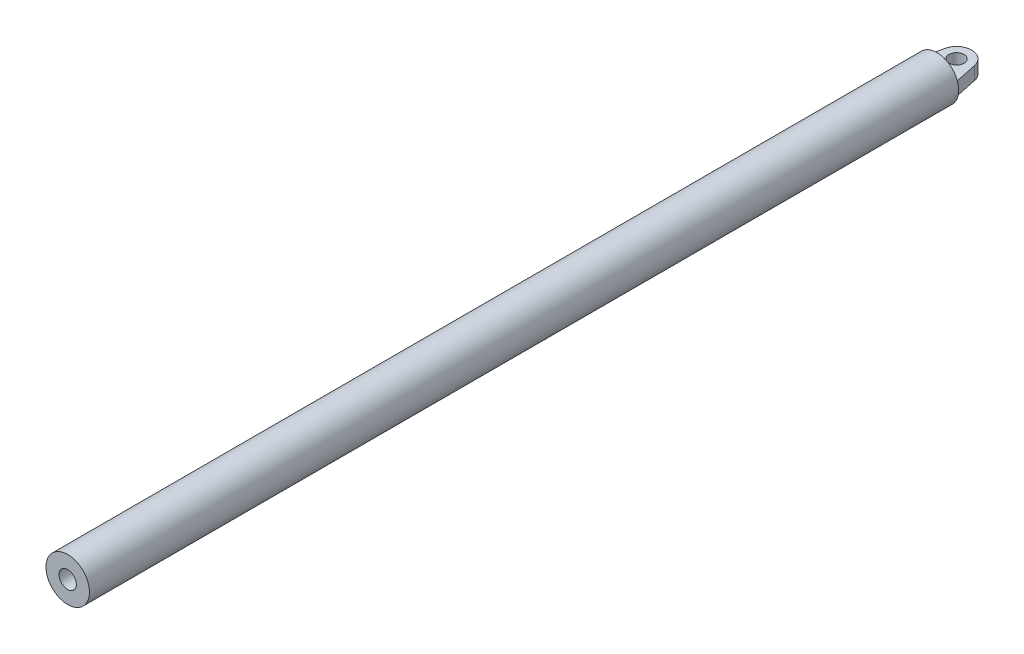
ISO-10303-21;
HEADER;
FILE_DESCRIPTION(('STEP AP214'),'2;1');
FILE_NAME('part.step','',(''),(''),'','','');
FILE_SCHEMA(('AUTOMOTIVE_DESIGN { 1 0 10303 214 1 1 1 1 }'));
ENDSEC;
DATA;
#1=APPLICATION_CONTEXT('core data for automotive mechanical design processes');
#2=APPLICATION_PROTOCOL_DEFINITION('international standard','automotive_design',2000,#1);
#3=PRODUCT_CONTEXT('',#1,'mechanical');
#4=PRODUCT('Part','Part','',(#3));
#5=PRODUCT_RELATED_PRODUCT_CATEGORY('part','',(#4));
#6=PRODUCT_DEFINITION_FORMATION('','',#4);
#7=PRODUCT_DEFINITION_CONTEXT('part definition',#1,'design');
#8=PRODUCT_DEFINITION('design','',#6,#7);
#9=PRODUCT_DEFINITION_SHAPE('','',#8);
#10=(LENGTH_UNIT() NAMED_UNIT(*) SI_UNIT(.MILLI.,.METRE.));
#11=(NAMED_UNIT(*) PLANE_ANGLE_UNIT() SI_UNIT($,.RADIAN.));
#12=(NAMED_UNIT(*) SI_UNIT($,.STERADIAN.) SOLID_ANGLE_UNIT());
#13=UNCERTAINTY_MEASURE_WITH_UNIT(LENGTH_MEASURE(1.E-05),#10,'distance_accuracy_value','');
#14=(GEOMETRIC_REPRESENTATION_CONTEXT(3) GLOBAL_UNCERTAINTY_ASSIGNED_CONTEXT((#13)) GLOBAL_UNIT_ASSIGNED_CONTEXT((#10,
#11,#12)) REPRESENTATION_CONTEXT('',''));
#15=CARTESIAN_POINT('',(0.,0.,0.));
#16=DIRECTION('',(0.,0.,1.));
#17=DIRECTION('',(1.,0.,0.));
#18=AXIS2_PLACEMENT_3D('',#15,#16,#17);
#19=CARTESIAN_POINT('',(0.,0.,2000.));
#20=DIRECTION('',(0.,0.,-1.));
#21=DIRECTION('',(-1.,0.,0.));
#22=AXIS2_PLACEMENT_3D('',#19,#20,#21);
#23=CYLINDRICAL_SURFACE('',#22,50.);
#24=CARTESIAN_POINT('',(0.,0.,2000.));
#25=DIRECTION('',(0.,0.,1.));
#26=DIRECTION('',(1.,0.,0.));
#27=AXIS2_PLACEMENT_3D('',#24,#25,#26);
#28=CIRCLE('',#27,50.);
#29=CARTESIAN_POINT('',(50.,0.,2000.));
#30=VERTEX_POINT('',#29);
#31=EDGE_CURVE('E11',#30,#30,#28,.T.);
#32=ORIENTED_EDGE('',*,*,#31,.F.);
#33=EDGE_LOOP('',(#32));
#34=FACE_BOUND('',#33,.T.);
#35=CARTESIAN_POINT('',(0.,0.,0.));
#36=DIRECTION('',(0.,0.,1.));
#37=DIRECTION('',(1.,0.,0.));
#38=AXIS2_PLACEMENT_3D('',#35,#36,#37);
#39=CIRCLE('',#38,50.);
#40=CARTESIAN_POINT('',(50.,0.,0.));
#41=VERTEX_POINT('',#40);
#42=EDGE_CURVE('E39',#41,#41,#39,.T.);
#43=ORIENTED_EDGE('',*,*,#42,.T.);
#44=EDGE_LOOP('',(#43));
#45=FACE_BOUND('',#44,.T.);
#46=ADVANCED_FACE('F36',(#34,#45),#23,.T.);
#47=CARTESIAN_POINT('',(0.,0.,2000.));
#48=DIRECTION('',(0.,0.,1.));
#49=DIRECTION('',(1.,0.,0.));
#50=AXIS2_PLACEMENT_3D('',#47,#48,#49);
#51=PLANE('',#50);
#52=CARTESIAN_POINT('',(0.,0.,2000.));
#53=DIRECTION('',(0.,0.,1.));
#54=DIRECTION('',(1.,0.,0.));
#55=AXIS2_PLACEMENT_3D('',#52,#53,#54);
#56=CIRCLE('',#55,20.);
#57=CARTESIAN_POINT('',(20.,0.,2000.));
#58=VERTEX_POINT('',#57);
#59=EDGE_CURVE('E118',#58,#58,#56,.T.);
#60=ORIENTED_EDGE('',*,*,#59,.F.);
#61=EDGE_LOOP('',(#60));
#62=FACE_BOUND('',#61,.T.);
#63=ORIENTED_EDGE('',*,*,#31,.T.);
#64=EDGE_LOOP('',(#63));
#65=FACE_BOUND('',#64,.T.);
#66=ADVANCED_FACE('F129',(#62,#65),#51,.T.);
#67=CARTESIAN_POINT('',(0.,0.,0.));
#68=DIRECTION('',(0.,0.,1.));
#69=DIRECTION('',(1.,0.,0.));
#70=AXIS2_PLACEMENT_3D('',#67,#68,#69);
#71=PLANE('',#70);
#72=DIRECTION('',(0.,-1.,0.));
#73=VECTOR('',#72,1.);
#74=CARTESIAN_POINT('',(45.,15.,0.));
#75=LINE('',#74,#73);
#76=CARTESIAN_POINT('',(45.,15.,0.));
#77=VERTEX_POINT('',#76);
#78=CARTESIAN_POINT('',(45.,-15.,0.));
#79=VERTEX_POINT('',#78);
#80=EDGE_CURVE('E50',#77,#79,#75,.T.);
#81=ORIENTED_EDGE('',*,*,#80,.F.);
#82=DIRECTION('',(1.,0.,0.));
#83=VECTOR('',#82,1.);
#84=CARTESIAN_POINT('',(0.,15.,0.));
#85=LINE('',#84,#83);
#86=CARTESIAN_POINT('',(-45.,15.,0.));
#87=VERTEX_POINT('',#86);
#88=EDGE_CURVE('E54',#87,#77,#85,.T.);
#89=ORIENTED_EDGE('',*,*,#88,.F.);
#90=DIRECTION('',(0.,-1.,0.));
#91=VECTOR('',#90,1.);
#92=CARTESIAN_POINT('',(-45.,15.,0.));
#93=LINE('',#92,#91);
#94=CARTESIAN_POINT('',(-45.,-15.,0.));
#95=VERTEX_POINT('',#94);
#96=EDGE_CURVE('E96',#87,#95,#93,.T.);
#97=ORIENTED_EDGE('',*,*,#96,.T.);
#98=DIRECTION('',(1.,0.,0.));
#99=VECTOR('',#98,1.);
#100=CARTESIAN_POINT('',(0.,-15.,0.));
#101=LINE('',#100,#99);
#102=EDGE_CURVE('E103',#95,#79,#101,.T.);
#103=ORIENTED_EDGE('',*,*,#102,.T.);
#104=EDGE_LOOP('',(#81,#89,#97,#103));
#105=FACE_BOUND('',#104,.T.);
#106=ORIENTED_EDGE('',*,*,#42,.F.);
#107=EDGE_LOOP('',(#106));
#108=FACE_BOUND('',#107,.T.);
#109=ADVANCED_FACE('F126',(#105,#108),#71,.F.);
#110=CARTESIAN_POINT('',(0.,0.,2000.));
#111=DIRECTION('',(0.,0.,-1.));
#112=DIRECTION('',(-1.,0.,0.));
#113=AXIS2_PLACEMENT_3D('',#110,#111,#112);
#114=CYLINDRICAL_SURFACE('',#113,20.);
#115=ORIENTED_EDGE('',*,*,#59,.T.);
#116=EDGE_LOOP('',(#115));
#117=FACE_BOUND('',#116,.T.);
#118=CARTESIAN_POINT('',(0.,0.,30.));
#119=DIRECTION('',(0.,0.,1.));
#120=DIRECTION('',(1.,0.,0.));
#121=AXIS2_PLACEMENT_3D('',#118,#119,#120);
#122=CIRCLE('',#121,20.);
#123=CARTESIAN_POINT('',(20.,0.,30.));
#124=VERTEX_POINT('',#123);
#125=EDGE_CURVE('E115',#124,#124,#122,.T.);
#126=ORIENTED_EDGE('',*,*,#125,.F.);
#127=EDGE_LOOP('',(#126));
#128=FACE_BOUND('',#127,.T.);
#129=ADVANCED_FACE('F128',(#117,#128),#114,.F.);
#130=CARTESIAN_POINT('',(0.,0.,30.));
#131=DIRECTION('',(0.,0.,1.));
#132=DIRECTION('',(1.,0.,0.));
#133=AXIS2_PLACEMENT_3D('',#130,#131,#132);
#134=PLANE('',#133);
#135=ORIENTED_EDGE('',*,*,#125,.T.);
#136=EDGE_LOOP('',(#135));
#137=FACE_BOUND('',#136,.T.);
#138=ADVANCED_FACE('F134',(#137),#134,.T.);
#139=CARTESIAN_POINT('',(43.1697279692063,15.,-8.88888888888885));
#140=DIRECTION('',(0.979452545151925,0.,-0.201674767374146));
#141=DIRECTION('',(-0.201674767374146,0.,-0.979452545151925));
#142=AXIS2_PLACEMENT_3D('',#139,#140,#141);
#143=PLANE('',#142);
#144=DIRECTION('',(0.201674767374146,0.,0.979452545151925));
#145=VECTOR('',#144,1.);
#146=CARTESIAN_POINT('',(43.1697279692063,-15.,-8.88888888888885));
#147=LINE('',#146,#145);
#148=CARTESIAN_POINT('',(34.2808390803174,-15.,-52.0586168580951));
#149=VERTEX_POINT('',#148);
#150=EDGE_CURVE('E79',#149,#79,#147,.T.);
#151=ORIENTED_EDGE('',*,*,#150,.F.);
#152=DIRECTION('',(0.,-1.,0.));
#153=VECTOR('',#152,1.);
#154=CARTESIAN_POINT('',(34.2808390803174,15.,-52.0586168580951));
#155=LINE('',#154,#153);
#156=CARTESIAN_POINT('',(34.2808390803174,15.,-52.0586168580951));
#157=VERTEX_POINT('',#156);
#158=EDGE_CURVE('E74',#157,#149,#155,.T.);
#159=ORIENTED_EDGE('',*,*,#158,.F.);
#160=DIRECTION('',(0.201674767374146,0.,0.979452545151925));
#161=VECTOR('',#160,1.);
#162=CARTESIAN_POINT('',(43.1697279692063,15.,-8.88888888888885));
#163=LINE('',#162,#161);
#164=EDGE_CURVE('E77',#157,#77,#163,.T.);
#165=ORIENTED_EDGE('',*,*,#164,.T.);
#166=ORIENTED_EDGE('',*,*,#80,.T.);
#167=EDGE_LOOP('',(#151,#159,#165,#166));
#168=FACE_BOUND('',#167,.T.);
#169=ADVANCED_FACE('F76',(#168),#143,.T.);
#170=CARTESIAN_POINT('',(0.,15.,-45.));
#171=DIRECTION('',(0.,-1.,0.));
#172=DIRECTION('',(0.,0.,-1.));
#173=AXIS2_PLACEMENT_3D('',#170,#171,#172);
#174=CYLINDRICAL_SURFACE('',#173,35.);
#175=CARTESIAN_POINT('',(0.,-15.,-45.));
#176=DIRECTION('',(0.,1.,0.));
#177=DIRECTION('',(0.,0.,1.));
#178=AXIS2_PLACEMENT_3D('',#175,#176,#177);
#179=CIRCLE('',#178,35.);
#180=CARTESIAN_POINT('',(-34.2808390803174,-15.,-52.0586168580951));
#181=VERTEX_POINT('',#180);
#182=EDGE_CURVE('E106',#181,#149,#179,.F.);
#183=ORIENTED_EDGE('',*,*,#182,.F.);
#184=DIRECTION('',(0.,-1.,0.));
#185=VECTOR('',#184,1.);
#186=CARTESIAN_POINT('',(-34.2808390803174,15.,-52.0586168580951));
#187=LINE('',#186,#185);
#188=CARTESIAN_POINT('',(-34.2808390803174,15.,-52.0586168580951));
#189=VERTEX_POINT('',#188);
#190=EDGE_CURVE('E84',#189,#181,#187,.T.);
#191=ORIENTED_EDGE('',*,*,#190,.F.);
#192=CARTESIAN_POINT('',(0.,15.,-45.));
#193=DIRECTION('',(0.,1.,0.));
#194=DIRECTION('',(0.,0.,1.));
#195=AXIS2_PLACEMENT_3D('',#192,#193,#194);
#196=CIRCLE('',#195,35.);
#197=EDGE_CURVE('E90',#189,#157,#196,.F.);
#198=ORIENTED_EDGE('',*,*,#197,.T.);
#199=ORIENTED_EDGE('',*,*,#158,.T.);
#200=EDGE_LOOP('',(#183,#191,#198,#199));
#201=FACE_BOUND('',#200,.T.);
#202=ADVANCED_FACE('F93',(#201),#174,.T.);
#203=CARTESIAN_POINT('',(0.,15.,-45.));
#204=DIRECTION('',(0.,-1.,0.));
#205=DIRECTION('',(0.,0.,-1.));
#206=AXIS2_PLACEMENT_3D('',#203,#204,#205);
#207=CYLINDRICAL_SURFACE('',#206,17.5);
#208=CARTESIAN_POINT('',(0.,15.,-45.));
#209=DIRECTION('',(0.,1.,0.));
#210=DIRECTION('',(0.,0.,1.));
#211=AXIS2_PLACEMENT_3D('',#208,#209,#210);
#212=CIRCLE('',#211,17.5);
#213=CARTESIAN_POINT('',(0.,15.,-27.5));
#214=VERTEX_POINT('',#213);
#215=EDGE_CURVE('E111',#214,#214,#212,.T.);
#216=ORIENTED_EDGE('',*,*,#215,.T.);
#217=EDGE_LOOP('',(#216));
#218=FACE_BOUND('',#217,.T.);
#219=CARTESIAN_POINT('',(0.,-15.,-45.));
#220=DIRECTION('',(0.,1.,0.));
#221=DIRECTION('',(0.,0.,1.));
#222=AXIS2_PLACEMENT_3D('',#219,#220,#221);
#223=CIRCLE('',#222,17.5);
#224=CARTESIAN_POINT('',(0.,-15.,-27.5));
#225=VERTEX_POINT('',#224);
#226=EDGE_CURVE('E100',#225,#225,#223,.T.);
#227=ORIENTED_EDGE('',*,*,#226,.F.);
#228=EDGE_LOOP('',(#227));
#229=FACE_BOUND('',#228,.T.);
#230=ADVANCED_FACE('F184',(#218,#229),#207,.F.);
#231=CARTESIAN_POINT('',(-43.1697279692063,15.,-8.88888888888885));
#232=DIRECTION('',(-0.979452545151925,0.,-0.201674767374146));
#233=DIRECTION('',(-0.201674767374146,0.,0.979452545151925));
#234=AXIS2_PLACEMENT_3D('',#231,#232,#233);
#235=PLANE('',#234);
#236=DIRECTION('',(0.201674767374146,0.,-0.979452545151925));
#237=VECTOR('',#236,1.);
#238=CARTESIAN_POINT('',(-43.1697279692063,-15.,-8.88888888888885));
#239=LINE('',#238,#237);
#240=EDGE_CURVE('E108',#95,#181,#239,.T.);
#241=ORIENTED_EDGE('',*,*,#240,.F.);
#242=ORIENTED_EDGE('',*,*,#96,.F.);
#243=DIRECTION('',(0.201674767374146,0.,-0.979452545151925));
#244=VECTOR('',#243,1.);
#245=CARTESIAN_POINT('',(-43.1697279692063,15.,-8.88888888888885));
#246=LINE('',#245,#244);
#247=EDGE_CURVE('E94',#87,#189,#246,.T.);
#248=ORIENTED_EDGE('',*,*,#247,.T.);
#249=ORIENTED_EDGE('',*,*,#190,.T.);
#250=EDGE_LOOP('',(#241,#242,#248,#249));
#251=FACE_BOUND('',#250,.T.);
#252=ADVANCED_FACE('F193',(#251),#235,.T.);
#253=CARTESIAN_POINT('',(0.,15.,0.));
#254=DIRECTION('',(0.,1.,0.));
#255=DIRECTION('',(0.,0.,1.));
#256=AXIS2_PLACEMENT_3D('',#253,#254,#255);
#257=PLANE('',#256);
#258=ORIENTED_EDGE('',*,*,#215,.F.);
#259=EDGE_LOOP('',(#258));
#260=FACE_BOUND('',#259,.T.);
#261=ORIENTED_EDGE('',*,*,#88,.T.);
#262=ORIENTED_EDGE('',*,*,#164,.F.);
#263=ORIENTED_EDGE('',*,*,#197,.F.);
#264=ORIENTED_EDGE('',*,*,#247,.F.);
#265=EDGE_LOOP('',(#261,#262,#263,#264));
#266=FACE_BOUND('',#265,.T.);
#267=ADVANCED_FACE('F88',(#260,#266),#257,.T.);
#268=CARTESIAN_POINT('',(0.,-15.,0.));
#269=DIRECTION('',(0.,1.,0.));
#270=DIRECTION('',(0.,0.,1.));
#271=AXIS2_PLACEMENT_3D('',#268,#269,#270);
#272=PLANE('',#271);
#273=ORIENTED_EDGE('',*,*,#226,.T.);
#274=EDGE_LOOP('',(#273));
#275=FACE_BOUND('',#274,.T.);
#276=ORIENTED_EDGE('',*,*,#102,.F.);
#277=ORIENTED_EDGE('',*,*,#240,.T.);
#278=ORIENTED_EDGE('',*,*,#182,.T.);
#279=ORIENTED_EDGE('',*,*,#150,.T.);
#280=EDGE_LOOP('',(#276,#277,#278,#279));
#281=FACE_BOUND('',#280,.T.);
#282=ADVANCED_FACE('F213',(#275,#281),#272,.F.);
#283=CLOSED_SHELL('',(#46,#66,#109,#129,#138,#169,#202,#230,#252,#267,#282));
#284=MANIFOLD_SOLID_BREP('B2',#283);
#285=ADVANCED_BREP_SHAPE_REPRESENTATION('',(#18,#284),#14);
#286=SHAPE_DEFINITION_REPRESENTATION(#9,#285);
ENDSEC;
END-ISO-10303-21;
